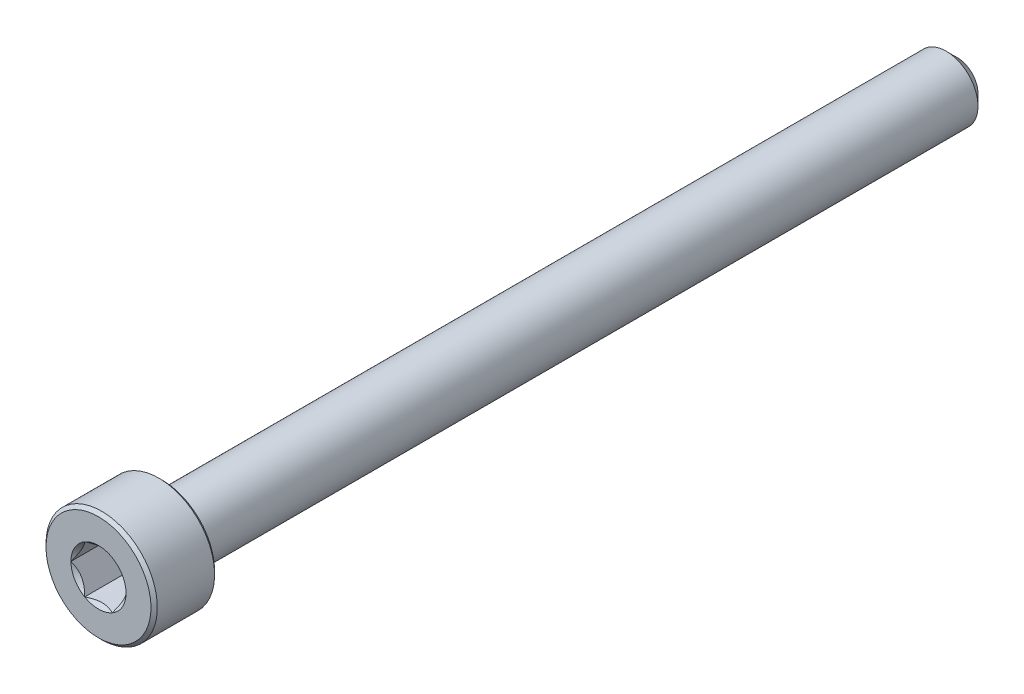
ISO-10303-21;
HEADER;
FILE_DESCRIPTION(('STEP AP214'),'2;1');
FILE_NAME('part.step','',(''),(''),'','','');
FILE_SCHEMA(('AUTOMOTIVE_DESIGN { 1 0 10303 214 1 1 1 1 }'));
ENDSEC;
DATA;
#1=APPLICATION_CONTEXT('core data for automotive mechanical design processes');
#2=APPLICATION_PROTOCOL_DEFINITION('international standard','automotive_design',2000,#1);
#3=PRODUCT_CONTEXT('',#1,'mechanical');
#4=PRODUCT('Part','Part','',(#3));
#5=PRODUCT_RELATED_PRODUCT_CATEGORY('part','',(#4));
#6=PRODUCT_DEFINITION_FORMATION('','',#4);
#7=PRODUCT_DEFINITION_CONTEXT('part definition',#1,'design');
#8=PRODUCT_DEFINITION('design','',#6,#7);
#9=PRODUCT_DEFINITION_SHAPE('','',#8);
#10=(LENGTH_UNIT() NAMED_UNIT(*) SI_UNIT(.MILLI.,.METRE.));
#11=(NAMED_UNIT(*) PLANE_ANGLE_UNIT() SI_UNIT($,.RADIAN.));
#12=(NAMED_UNIT(*) SI_UNIT($,.STERADIAN.) SOLID_ANGLE_UNIT());
#13=UNCERTAINTY_MEASURE_WITH_UNIT(LENGTH_MEASURE(1.E-05),#10,'distance_accuracy_value','');
#14=(GEOMETRIC_REPRESENTATION_CONTEXT(3) GLOBAL_UNCERTAINTY_ASSIGNED_CONTEXT((#13)) GLOBAL_UNIT_ASSIGNED_CONTEXT((#10,
#11,#12)) REPRESENTATION_CONTEXT('',''));
#15=CARTESIAN_POINT('',(0.,0.,0.));
#16=DIRECTION('',(0.,0.,1.));
#17=DIRECTION('',(1.,0.,0.));
#18=AXIS2_PLACEMENT_3D('',#15,#16,#17);
#19=CARTESIAN_POINT('',(0.,0.,27.));
#20=DIRECTION('',(0.,0.,1.));
#21=DIRECTION('',(1.,0.,0.));
#22=AXIS2_PLACEMENT_3D('',#19,#20,#21);
#23=PLANE('',#22);
#24=CARTESIAN_POINT('',(0.,0.,27.));
#25=DIRECTION('',(0.,0.,1.));
#26=DIRECTION('',(1.,0.,0.));
#27=AXIS2_PLACEMENT_3D('',#24,#25,#26);
#28=CIRCLE('',#27,1.73205080756888);
#29=CARTESIAN_POINT('',(1.73205080756888,0.,27.));
#30=VERTEX_POINT('',#29);
#31=CARTESIAN_POINT('',(0.866025403784439,1.5,27.));
#32=VERTEX_POINT('',#31);
#33=EDGE_CURVE('E105',#30,#32,#28,.T.);
#34=ORIENTED_EDGE('',*,*,#33,.F.);
#35=CARTESIAN_POINT('',(0.866025403784438,-1.5,27.));
#36=VERTEX_POINT('',#35);
#37=EDGE_CURVE('E95',#36,#30,#28,.T.);
#38=ORIENTED_EDGE('',*,*,#37,.F.);
#39=CARTESIAN_POINT('',(-0.866025403784438,-1.5,27.));
#40=VERTEX_POINT('',#39);
#41=EDGE_CURVE('E103',#40,#36,#28,.T.);
#42=ORIENTED_EDGE('',*,*,#41,.F.);
#43=CARTESIAN_POINT('',(-1.73205080756888,0.,27.));
#44=VERTEX_POINT('',#43);
#45=EDGE_CURVE('E267',#44,#40,#28,.T.);
#46=ORIENTED_EDGE('',*,*,#45,.F.);
#47=CARTESIAN_POINT('',(-0.866025403784438,1.5,27.));
#48=VERTEX_POINT('',#47);
#49=EDGE_CURVE('E127',#48,#44,#28,.T.);
#50=ORIENTED_EDGE('',*,*,#49,.F.);
#51=EDGE_CURVE('E126',#32,#48,#28,.T.);
#52=ORIENTED_EDGE('',*,*,#51,.F.);
#53=EDGE_LOOP('',(#34,#38,#42,#46,#50,#52));
#54=FACE_BOUND('',#53,.T.);
#55=CARTESIAN_POINT('',(0.,0.,27.));
#56=DIRECTION('',(0.,0.,-1.));
#57=DIRECTION('',(-1.,0.,0.));
#58=AXIS2_PLACEMENT_3D('',#55,#56,#57);
#59=CIRCLE('',#58,3.3);
#60=CARTESIAN_POINT('',(-3.3,0.,27.));
#61=VERTEX_POINT('',#60);
#62=EDGE_CURVE('E49',#61,#61,#59,.T.);
#63=ORIENTED_EDGE('',*,*,#62,.F.);
#64=EDGE_LOOP('',(#63));
#65=FACE_BOUND('',#64,.T.);
#66=ADVANCED_FACE('F36',(#54,#65),#23,.T.);
#67=CARTESIAN_POINT('',(0.,0.,26.8));
#68=DIRECTION('',(0.,0.,-1.));
#69=DIRECTION('',(-1.,0.,0.));
#70=AXIS2_PLACEMENT_3D('',#67,#68,#69);
#71=CONICAL_SURFACE('',#70,3.5,0.785398163397454);
#72=ORIENTED_EDGE('',*,*,#62,.T.);
#73=EDGE_LOOP('',(#72));
#74=FACE_BOUND('',#73,.T.);
#75=CARTESIAN_POINT('',(0.,0.,26.8));
#76=DIRECTION('',(0.,0.,-1.));
#77=DIRECTION('',(-1.,0.,0.));
#78=AXIS2_PLACEMENT_3D('',#75,#76,#77);
#79=CIRCLE('',#78,3.5);
#80=CARTESIAN_POINT('',(-3.5,0.,26.8));
#81=VERTEX_POINT('',#80);
#82=EDGE_CURVE('E221',#81,#81,#79,.T.);
#83=ORIENTED_EDGE('',*,*,#82,.F.);
#84=EDGE_LOOP('',(#83));
#85=FACE_BOUND('',#84,.T.);
#86=ADVANCED_FACE('F209',(#74,#85),#71,.T.);
#87=CARTESIAN_POINT('',(0.,0.,-27.));
#88=DIRECTION('',(0.,0.,-1.));
#89=DIRECTION('',(-1.,0.,0.));
#90=AXIS2_PLACEMENT_3D('',#87,#88,#89);
#91=CYLINDRICAL_SURFACE('',#90,3.5);
#92=ORIENTED_EDGE('',*,*,#82,.T.);
#93=EDGE_LOOP('',(#92));
#94=FACE_BOUND('',#93,.T.);
#95=CARTESIAN_POINT('',(0.,0.,23.2));
#96=DIRECTION('',(0.,0.,-1.));
#97=DIRECTION('',(-1.,0.,0.));
#98=AXIS2_PLACEMENT_3D('',#95,#96,#97);
#99=CIRCLE('',#98,3.5);
#100=CARTESIAN_POINT('',(-3.5,0.,23.2));
#101=VERTEX_POINT('',#100);
#102=EDGE_CURVE('E222',#101,#101,#99,.T.);
#103=ORIENTED_EDGE('',*,*,#102,.F.);
#104=EDGE_LOOP('',(#103));
#105=FACE_BOUND('',#104,.T.);
#106=ADVANCED_FACE('F206',(#94,#105),#91,.T.);
#107=CARTESIAN_POINT('',(0.,0.,23.));
#108=DIRECTION('',(0.,0.,1.));
#109=DIRECTION('',(1.,0.,0.));
#110=AXIS2_PLACEMENT_3D('',#107,#108,#109);
#111=CONICAL_SURFACE('',#110,3.3,0.785398163397454);
#112=ORIENTED_EDGE('',*,*,#102,.T.);
#113=EDGE_LOOP('',(#112));
#114=FACE_BOUND('',#113,.T.);
#115=CARTESIAN_POINT('',(0.,0.,23.));
#116=DIRECTION('',(0.,0.,-1.));
#117=DIRECTION('',(-1.,0.,0.));
#118=AXIS2_PLACEMENT_3D('',#115,#116,#117);
#119=CIRCLE('',#118,3.3);
#120=CARTESIAN_POINT('',(-3.3,0.,23.));
#121=VERTEX_POINT('',#120);
#122=EDGE_CURVE('E225',#121,#121,#119,.T.);
#123=ORIENTED_EDGE('',*,*,#122,.F.);
#124=EDGE_LOOP('',(#123));
#125=FACE_BOUND('',#124,.T.);
#126=ADVANCED_FACE('F202',(#114,#125),#111,.T.);
#127=CARTESIAN_POINT('',(0.,3.3,23.));
#128=DIRECTION('',(0.,0.,-1.));
#129=DIRECTION('',(-1.,0.,0.));
#130=AXIS2_PLACEMENT_3D('',#127,#128,#129);
#131=PLANE('',#130);
#132=ORIENTED_EDGE('',*,*,#122,.T.);
#133=EDGE_LOOP('',(#132));
#134=FACE_BOUND('',#133,.T.);
#135=CARTESIAN_POINT('',(0.,0.,23.));
#136=DIRECTION('',(0.,0.,-1.));
#137=DIRECTION('',(-1.,0.,0.));
#138=AXIS2_PLACEMENT_3D('',#135,#136,#137);
#139=CIRCLE('',#138,2.);
#140=CARTESIAN_POINT('',(-2.,0.,23.));
#141=VERTEX_POINT('',#140);
#142=EDGE_CURVE('E230',#141,#141,#139,.T.);
#143=ORIENTED_EDGE('',*,*,#142,.F.);
#144=EDGE_LOOP('',(#143));
#145=FACE_BOUND('',#144,.T.);
#146=ADVANCED_FACE('F198',(#134,#145),#131,.T.);
#147=CARTESIAN_POINT('',(0.,0.,-27.));
#148=DIRECTION('',(0.,0.,-1.));
#149=DIRECTION('',(-1.,0.,0.));
#150=AXIS2_PLACEMENT_3D('',#147,#148,#149);
#151=CYLINDRICAL_SURFACE('',#150,2.);
#152=ORIENTED_EDGE('',*,*,#142,.T.);
#153=EDGE_LOOP('',(#152));
#154=FACE_BOUND('',#153,.T.);
#155=CARTESIAN_POINT('',(0.,0.,-26.3));
#156=DIRECTION('',(0.,0.,-1.));
#157=DIRECTION('',(-1.,0.,0.));
#158=AXIS2_PLACEMENT_3D('',#155,#156,#157);
#159=CIRCLE('',#158,2.);
#160=CARTESIAN_POINT('',(-2.,0.,-26.3));
#161=VERTEX_POINT('',#160);
#162=EDGE_CURVE('E233',#161,#161,#159,.T.);
#163=ORIENTED_EDGE('',*,*,#162,.F.);
#164=EDGE_LOOP('',(#163));
#165=FACE_BOUND('',#164,.T.);
#166=ADVANCED_FACE('F194',(#154,#165),#151,.T.);
#167=CARTESIAN_POINT('',(0.,0.,-27.));
#168=DIRECTION('',(0.,0.,1.));
#169=DIRECTION('',(1.,0.,0.));
#170=AXIS2_PLACEMENT_3D('',#167,#168,#169);
#171=CONICAL_SURFACE('',#170,1.3,0.78539816339744);
#172=ORIENTED_EDGE('',*,*,#162,.T.);
#173=EDGE_LOOP('',(#172));
#174=FACE_BOUND('',#173,.T.);
#175=CARTESIAN_POINT('',(0.,0.,-27.));
#176=DIRECTION('',(0.,0.,-1.));
#177=DIRECTION('',(-1.,0.,0.));
#178=AXIS2_PLACEMENT_3D('',#175,#176,#177);
#179=CIRCLE('',#178,1.3);
#180=CARTESIAN_POINT('',(-1.3,0.,-27.));
#181=VERTEX_POINT('',#180);
#182=EDGE_CURVE('E236',#181,#181,#179,.T.);
#183=ORIENTED_EDGE('',*,*,#182,.F.);
#184=EDGE_LOOP('',(#183));
#185=FACE_BOUND('',#184,.T.);
#186=ADVANCED_FACE('F190',(#174,#185),#171,.T.);
#187=CARTESIAN_POINT('',(0.,1.3,-27.));
#188=DIRECTION('',(0.,0.,-1.));
#189=DIRECTION('',(-1.,0.,0.));
#190=AXIS2_PLACEMENT_3D('',#187,#188,#189);
#191=PLANE('',#190);
#192=ORIENTED_EDGE('',*,*,#182,.T.);
#193=EDGE_LOOP('',(#192));
#194=FACE_BOUND('',#193,.T.);
#195=ADVANCED_FACE('F187',(#194),#191,.T.);
#196=CARTESIAN_POINT('',(0.,0.,27.));
#197=DIRECTION('',(0.,0.,1.));
#198=DIRECTION('',(1.,0.,0.));
#199=AXIS2_PLACEMENT_3D('',#196,#197,#198);
#200=CONICAL_SURFACE('',#199,1.73205080756888,0.78539816339745);
#201=ORIENTED_EDGE('',*,*,#33,.T.);
#202=CARTESIAN_POINT('',(1.73216627762272,-0.000200000000000874,27.0001154816001));
#203=CARTESIAN_POINT('',(1.70239359975915,0.0513677907370746,26.9703654760673));
#204=CARTESIAN_POINT('',(1.67212305186355,0.1037979176652,26.9423624839103));
#205=CARTESIAN_POINT('',(1.61039789003619,0.210709034055596,26.8910892304401));
#206=CARTESIAN_POINT('',(1.57893740312614,0.265200195814661,26.8678475050444));
#207=CARTESIAN_POINT('',(1.51549879897987,0.375079081357249,26.8280337289922));
#208=CARTESIAN_POINT('',(1.4835368452681,0.4304388090952,26.8113615856709));
#209=CARTESIAN_POINT('',(1.41890915196211,0.542377257477152,26.7856744568181));
#210=CARTESIAN_POINT('',(1.38624538781118,0.59895255655301,26.7766402904789));
#211=CARTESIAN_POINT('',(1.32995210095299,0.696455389516443,26.7684890812268));
#212=CARTESIAN_POINT('',(1.30639533311124,0.737256908280468,26.7672822529892));
#213=CARTESIAN_POINT('',(1.25932335290193,0.81878796961586,26.7693140571623));
#214=CARTESIAN_POINT('',(1.23580815085313,0.859517494314632,26.7725536707483));
#215=CARTESIAN_POINT('',(1.18900414978426,0.940584402163418,26.783291985982));
#216=CARTESIAN_POINT('',(1.16571558211719,0.980921384598291,26.7907946530187));
#217=CARTESIAN_POINT('',(1.11952932016335,1.06091833691403,26.8096516119283));
#218=CARTESIAN_POINT('',(1.09663179808786,1.10057800851621,26.8210075570186));
#219=CARTESIAN_POINT('',(1.03798159809698,1.20216313477449,26.8547216475927));
#220=CARTESIAN_POINT('',(1.00259267147465,1.26345855370969,26.8796218490934));
#221=CARTESIAN_POINT('',(0.950557780604374,1.35358562846331,26.9216566532716));
#222=CARTESIAN_POINT('',(0.933410759677147,1.38328513990772,26.9364251535591));
#223=CARTESIAN_POINT('',(0.899432101996406,1.44213790138375,26.9673105659402));
#224=CARTESIAN_POINT('',(0.88260031928571,1.47129140422064,26.9834268341217));
#225=CARTESIAN_POINT('',(0.865909933730601,1.5002,27.0001154816001));
#226=B_SPLINE_CURVE_WITH_KNOTS('',3,(#202,#203,#204,#205,#206,#207,#208,#209,#210,#211,#212,
#213,#214,#215,#216,#217,#218,#219,#220,#221,#222,#223,#224,#225),.UNSPECIFIED.,.F.,.F.,(4,2,2,
2,2,2,2,2,2,2,2,4),(0.,0.199829143693305,0.40082298738239,0.598623720538184,0.795926240188893,
0.937113067959885,1.07833105577193,1.21968061668222,1.36109089931055,1.58570969637566,
1.69770705470964,1.80965120737194),.UNSPECIFIED.);
#227=EDGE_CURVE('E12',#30,#32,#226,.T.);
#228=ORIENTED_EDGE('',*,*,#227,.F.);
#229=EDGE_LOOP('',(#201,#228));
#230=FACE_BOUND('',#229,.T.);
#231=ADVANCED_FACE('F107',(#230),#200,.F.);
#232=ORIENTED_EDGE('',*,*,#37,.T.);
#233=CARTESIAN_POINT('',(0.8659099337306,-1.5002,27.0001154816001));
#234=CARTESIAN_POINT('',(0.895682611594165,-1.44863220926293,26.9703654760673));
#235=CARTESIAN_POINT('',(0.925953159489764,-1.3962020823348,26.9423624839103));
#236=CARTESIAN_POINT('',(0.987678321317123,-1.2892909659444,26.8910892304401));
#237=CARTESIAN_POINT('',(1.01913880822717,-1.23479980418534,26.8678475050444));
#238=CARTESIAN_POINT('',(1.08257741237344,-1.12492091864275,26.8280337289922));
#239=CARTESIAN_POINT('',(1.11453936608521,-1.0695611909048,26.8113615856709));
#240=CARTESIAN_POINT('',(1.1791670593912,-0.957622742522849,26.7856744568181));
#241=CARTESIAN_POINT('',(1.21183082354213,-0.901047443446991,26.7766402904789));
#242=CARTESIAN_POINT('',(1.26812411040032,-0.803544610483558,26.7684890812268));
#243=CARTESIAN_POINT('',(1.29168087824208,-0.762743091719533,26.7672822529892));
#244=CARTESIAN_POINT('',(1.33875285845138,-0.681212030384141,26.7693140571623));
#245=CARTESIAN_POINT('',(1.36226806050018,-0.64048250568537,26.7725536707483));
#246=CARTESIAN_POINT('',(1.40907206156905,-0.559415597836583,26.783291985982));
#247=CARTESIAN_POINT('',(1.43236062923612,-0.519078615401711,26.7907946530187));
#248=CARTESIAN_POINT('',(1.47854689118997,-0.439081663085968,26.8096516119283));
#249=CARTESIAN_POINT('',(1.50144441326545,-0.399421991483791,26.8210075570186));
#250=CARTESIAN_POINT('',(1.56009461325633,-0.297836865225514,26.8547216475927));
#251=CARTESIAN_POINT('',(1.59548353987866,-0.23654144629031,26.8796218490934));
#252=CARTESIAN_POINT('',(1.64751843074894,-0.146414371536685,26.9216566532716));
#253=CARTESIAN_POINT('',(1.66466545167617,-0.116714860092281,26.9364251535591));
#254=CARTESIAN_POINT('',(1.69864410935691,-0.0578620986162484,26.9673105659402));
#255=CARTESIAN_POINT('',(1.71547589206761,-0.0287085957793627,26.9834268341217));
#256=CARTESIAN_POINT('',(1.73216627762272,0.000199999999999534,27.0001154816001));
#257=B_SPLINE_CURVE_WITH_KNOTS('',3,(#233,#234,#235,#236,#237,#238,#239,#240,#241,#242,#243,
#244,#245,#246,#247,#248,#249,#250,#251,#252,#253,#254,#255,#256),.UNSPECIFIED.,.F.,.F.,(4,2,2,
2,2,2,2,2,2,2,2,4),(0.,0.199829143693305,0.40082298738239,0.598623720538183,0.795926240188891,
0.937113067959883,1.07833105577193,1.21968061668222,1.36109089931055,1.58570969637566,
1.69770705470964,1.80965120737194),.UNSPECIFIED.);
#258=EDGE_CURVE('E98',#36,#30,#257,.T.);
#259=ORIENTED_EDGE('',*,*,#258,.F.);
#260=EDGE_LOOP('',(#232,#259));
#261=FACE_BOUND('',#260,.T.);
#262=ADVANCED_FACE('F97',(#261),#200,.F.);
#263=ORIENTED_EDGE('',*,*,#41,.T.);
#264=CARTESIAN_POINT('',(-1.72720812969692,-1.5,27.5555785162708));
#265=CARTESIAN_POINT('',(-1.68515175699268,-1.5,27.5238299078574));
#266=CARTESIAN_POINT('',(-1.64286104748674,-1.5,27.4923925938074));
#267=CARTESIAN_POINT('',(-1.55771581035942,-1.5,27.4302690875564));
#268=CARTESIAN_POINT('',(-1.51486114386668,-1.5,27.3995830858922));
#269=CARTESIAN_POINT('',(-1.3846813415127,-1.5,27.3084071924272));
#270=CARTESIAN_POINT('',(-1.29637976071654,-1.5,27.2492883434268));
#271=CARTESIAN_POINT('',(-1.11121478730467,-1.5,27.1332309963165));
#272=CARTESIAN_POINT('',(-1.01415038238167,-1.5,27.076609558733));
#273=CARTESIAN_POINT('',(-0.815173408897603,-1.5,26.9730368812656));
#274=CARTESIAN_POINT('',(-0.713278669253283,-1.5,26.9260530415417));
#275=CARTESIAN_POINT('',(-0.56033377494311,-1.5,26.8685726684308));
#276=CARTESIAN_POINT('',(-0.511547982948041,-1.5,26.8520753877572));
#277=CARTESIAN_POINT('',(-0.412798620136866,-1.5,26.822997512927));
#278=CARTESIAN_POINT('',(-0.362834968437562,-1.5,26.810417188594));
#279=CARTESIAN_POINT('',(-0.262863235444983,-1.5,26.7900361941468));
#280=CARTESIAN_POINT('',(-0.212872113808024,-1.5,26.782153632746));
#281=CARTESIAN_POINT('',(-0.112355243569547,-1.5,26.771322063969));
#282=CARTESIAN_POINT('',(-0.0618295883726288,-1.5,26.7683722085243));
#283=CARTESIAN_POINT('',(0.0374291733323834,-1.5,26.7676248577248));
#284=CARTESIAN_POINT('',(0.0861609672002981,-1.5,26.7696447335581));
#285=CARTESIAN_POINT('',(0.183206937768826,-1.5,26.7783225528968));
#286=CARTESIAN_POINT('',(0.231521073438268,-1.5,26.7849809469685));
#287=CARTESIAN_POINT('',(0.328199853425434,-1.5,26.8026852441226));
#288=CARTESIAN_POINT('',(0.376550616310327,-1.5,26.813805811257));
#289=CARTESIAN_POINT('',(0.472195697125598,-1.5,26.8398434140487));
#290=CARTESIAN_POINT('',(0.51949010309274,-1.5,26.8547601320409));
#291=CARTESIAN_POINT('',(0.668391282696623,-1.5,26.9073352235961));
#292=CARTESIAN_POINT('',(0.767878709508551,-1.5,26.950981287472));
#293=CARTESIAN_POINT('',(0.962179866690722,-1.5,27.0480229945931));
#294=CARTESIAN_POINT('',(1.05697519961444,-1.5,27.1014536650895));
#295=CARTESIAN_POINT('',(1.23814273533383,-1.5,27.2116858520046));
#296=CARTESIAN_POINT('',(1.32469942181289,-1.5,27.2681879206986));
#297=CARTESIAN_POINT('',(1.45222331290673,-1.5,27.3555343015787));
#298=CARTESIAN_POINT('',(1.49418091978756,-1.5,27.38495775868));
#299=CARTESIAN_POINT('',(1.57752272931476,-1.5,27.4445828218305));
#300=CARTESIAN_POINT('',(1.61890708647354,-1.5,27.4747842116644));
#301=CARTESIAN_POINT('',(1.66005278019494,-1.5,27.5053081786095));
#302=B_SPLINE_CURVE_WITH_KNOTS('',3,(#264,#265,#266,#267,#268,#269,#270,#271,#272,#273,#274,
#275,#276,#277,#278,#279,#280,#281,#282,#283,#284,#285,#286,#287,#288,#289,#290,#291,#292,#293,
#294,#295,#296,#297,#298,#299,#300,#301),.UNSPECIFIED.,.F.,.F.,(4,2,2,2,2,2,2,2,2,2,2,2,2,2,2,2,
2,2,4),(0.,0.158079548982667,0.31619878099394,0.634850417346958,0.97169031136151,
1.30737131660667,1.46173961127089,1.61611853740677,1.76772101421409,1.91929742368538,
2.065387412096,2.21149159305544,2.36014984633872,2.50879566386709,2.83376031422673,
3.15991186985651,3.46985601802197,3.62358896039973,3.7772796264207),.UNSPECIFIED.);
#303=EDGE_CURVE('E116',#40,#36,#302,.T.);
#304=ORIENTED_EDGE('',*,*,#303,.F.);
#305=EDGE_LOOP('',(#263,#304));
#306=FACE_BOUND('',#305,.T.);
#307=ADVANCED_FACE('F273',(#306),#200,.F.);
#308=ORIENTED_EDGE('',*,*,#45,.T.);
#309=CARTESIAN_POINT('',(-1.73216627762272,0.000200000000000134,27.0001154816001));
#310=CARTESIAN_POINT('',(-1.70239359975915,-0.0513677907370754,26.9703654760673));
#311=CARTESIAN_POINT('',(-1.67212305186355,-0.103797917665201,26.9423624839103));
#312=CARTESIAN_POINT('',(-1.61039789003619,-0.210709034055597,26.8910892304401));
#313=CARTESIAN_POINT('',(-1.57893740312614,-0.265200195814662,26.8678475050444));
#314=CARTESIAN_POINT('',(-1.51549879897987,-0.37507908135725,26.8280337289922));
#315=CARTESIAN_POINT('',(-1.4835368452681,-0.430438809095201,26.8113615856709));
#316=CARTESIAN_POINT('',(-1.41890915196211,-0.542377257477152,26.7856744568181));
#317=CARTESIAN_POINT('',(-1.38624538781118,-0.59895255655301,26.7766402904789));
#318=CARTESIAN_POINT('',(-1.32995210095299,-0.696455389516442,26.7684890812268));
#319=CARTESIAN_POINT('',(-1.30639533311124,-0.737256908280468,26.7672822529892));
#320=CARTESIAN_POINT('',(-1.25932335290193,-0.818787969615859,26.7693140571623));
#321=CARTESIAN_POINT('',(-1.23580815085313,-0.859517494314631,26.7725536707483));
#322=CARTESIAN_POINT('',(-1.18900414978427,-0.940584402163417,26.783291985982));
#323=CARTESIAN_POINT('',(-1.16571558211719,-0.98092138459829,26.7907946530187));
#324=CARTESIAN_POINT('',(-1.11952932016335,-1.06091833691403,26.8096516119283));
#325=CARTESIAN_POINT('',(-1.09663179808786,-1.10057800851621,26.8210075570186));
#326=CARTESIAN_POINT('',(-1.03798159809698,-1.20216313477449,26.8547216475927));
#327=CARTESIAN_POINT('',(-1.00259267147465,-1.26345855370969,26.8796218490934));
#328=CARTESIAN_POINT('',(-0.950557780604374,-1.35358562846332,26.9216566532716));
#329=CARTESIAN_POINT('',(-0.933410759677147,-1.38328513990772,26.9364251535591));
#330=CARTESIAN_POINT('',(-0.899432101996406,-1.44213790138375,26.9673105659402));
#331=CARTESIAN_POINT('',(-0.88260031928571,-1.47129140422064,26.9834268341217));
#332=CARTESIAN_POINT('',(-0.865909933730601,-1.5002,27.0001154816001));
#333=B_SPLINE_CURVE_WITH_KNOTS('',3,(#309,#310,#311,#312,#313,#314,#315,#316,#317,#318,#319,
#320,#321,#322,#323,#324,#325,#326,#327,#328,#329,#330,#331,#332),.UNSPECIFIED.,.F.,.F.,(4,2,2,
2,2,2,2,2,2,2,2,4),(0.,0.199829143693306,0.40082298738239,0.598623720538183,0.795926240188891,
0.937113067959883,1.07833105577193,1.21968061668222,1.36109089931055,1.58570969637566,
1.69770705470964,1.80965120737194),.UNSPECIFIED.);
#334=EDGE_CURVE('E153',#44,#40,#333,.T.);
#335=ORIENTED_EDGE('',*,*,#334,.F.);
#336=EDGE_LOOP('',(#308,#335));
#337=FACE_BOUND('',#336,.T.);
#338=ADVANCED_FACE('F306',(#337),#200,.F.);
#339=ORIENTED_EDGE('',*,*,#49,.T.);
#340=CARTESIAN_POINT('',(-0.865909933730601,1.5002,27.0001154816001));
#341=CARTESIAN_POINT('',(-0.895682611594165,1.44863220926292,26.9703654760673));
#342=CARTESIAN_POINT('',(-0.925953159489764,1.3962020823348,26.9423624839103));
#343=CARTESIAN_POINT('',(-0.987678321317123,1.2892909659444,26.8910892304401));
#344=CARTESIAN_POINT('',(-1.01913880822717,1.23479980418534,26.8678475050444));
#345=CARTESIAN_POINT('',(-1.08257741237344,1.12492091864275,26.8280337289922));
#346=CARTESIAN_POINT('',(-1.11453936608521,1.0695611909048,26.8113615856709));
#347=CARTESIAN_POINT('',(-1.1791670593912,0.957622742522849,26.7856744568181));
#348=CARTESIAN_POINT('',(-1.21183082354213,0.901047443446991,26.7766402904789));
#349=CARTESIAN_POINT('',(-1.26812411040032,0.803544610483558,26.7684890812268));
#350=CARTESIAN_POINT('',(-1.29168087824208,0.762743091719533,26.7672822529892));
#351=CARTESIAN_POINT('',(-1.33875285845138,0.68121203038414,26.7693140571623));
#352=CARTESIAN_POINT('',(-1.36226806050018,0.640482505685369,26.7725536707483));
#353=CARTESIAN_POINT('',(-1.40907206156905,0.559415597836583,26.783291985982));
#354=CARTESIAN_POINT('',(-1.43236062923612,0.51907861540171,26.7907946530187));
#355=CARTESIAN_POINT('',(-1.47854689118997,0.439081663085968,26.8096516119283));
#356=CARTESIAN_POINT('',(-1.50144441326545,0.399421991483791,26.8210075570186));
#357=CARTESIAN_POINT('',(-1.56009461325633,0.297836865225514,26.8547216475927));
#358=CARTESIAN_POINT('',(-1.59548353987866,0.236541446290309,26.8796218490934));
#359=CARTESIAN_POINT('',(-1.64751843074894,0.146414371536686,26.9216566532716));
#360=CARTESIAN_POINT('',(-1.66466545167617,0.116714860092283,26.9364251535591));
#361=CARTESIAN_POINT('',(-1.69864410935691,0.0578620986162502,26.9673105659402));
#362=CARTESIAN_POINT('',(-1.71547589206761,0.0287085957793638,26.9834268341217));
#363=CARTESIAN_POINT('',(-1.73216627762272,-0.000199999999999435,27.0001154816001));
#364=B_SPLINE_CURVE_WITH_KNOTS('',3,(#340,#341,#342,#343,#344,#345,#346,#347,#348,#349,#350,
#351,#352,#353,#354,#355,#356,#357,#358,#359,#360,#361,#362,#363),.UNSPECIFIED.,.F.,.F.,(4,2,2,
2,2,2,2,2,2,2,2,4),(0.,0.199829143693305,0.40082298738239,0.598623720538182,0.795926240188891,
0.937113067959884,1.07833105577193,1.21968061668222,1.36109089931055,1.58570969637566,
1.69770705470964,1.80965120737194),.UNSPECIFIED.);
#365=EDGE_CURVE('E160',#48,#44,#364,.T.);
#366=ORIENTED_EDGE('',*,*,#365,.F.);
#367=EDGE_LOOP('',(#339,#366));
#368=FACE_BOUND('',#367,.T.);
#369=ADVANCED_FACE('F145',(#368),#200,.F.);
#370=ORIENTED_EDGE('',*,*,#51,.T.);
#371=CARTESIAN_POINT('',(-1.72720812969692,1.5,27.5555785162708));
#372=CARTESIAN_POINT('',(-1.68515175699267,1.5,27.5238299078574));
#373=CARTESIAN_POINT('',(-1.64286104748673,1.5,27.4923925938074));
#374=CARTESIAN_POINT('',(-1.55771581035942,1.5,27.4302690875564));
#375=CARTESIAN_POINT('',(-1.51486114386668,1.5,27.3995830858922));
#376=CARTESIAN_POINT('',(-1.3846813415127,1.5,27.3084071924272));
#377=CARTESIAN_POINT('',(-1.29637976071653,1.5,27.2492883434268));
#378=CARTESIAN_POINT('',(-1.11121478730467,1.5,27.1332309963165));
#379=CARTESIAN_POINT('',(-1.01415038238167,1.5,27.076609558733));
#380=CARTESIAN_POINT('',(-0.815173408897604,1.5,26.9730368812656));
#381=CARTESIAN_POINT('',(-0.713278669253283,1.5,26.9260530415417));
#382=CARTESIAN_POINT('',(-0.560333774943111,1.5,26.8685726684308));
#383=CARTESIAN_POINT('',(-0.511547982948041,1.5,26.8520753877572));
#384=CARTESIAN_POINT('',(-0.412798620136866,1.5,26.822997512927));
#385=CARTESIAN_POINT('',(-0.362834968437562,1.5,26.810417188594));
#386=CARTESIAN_POINT('',(-0.262863235444981,1.5,26.7900361941468));
#387=CARTESIAN_POINT('',(-0.212872113808021,1.5,26.782153632746));
#388=CARTESIAN_POINT('',(-0.112355243569544,1.5,26.771322063969));
#389=CARTESIAN_POINT('',(-0.061829588372626,1.5,26.7683722085243));
#390=CARTESIAN_POINT('',(0.0374291733323862,1.5,26.7676248577248));
#391=CARTESIAN_POINT('',(0.086160967200301,1.5,26.7696447335581));
#392=CARTESIAN_POINT('',(0.183206937768829,1.5,26.7783225528968));
#393=CARTESIAN_POINT('',(0.231521073438271,1.5,26.7849809469685));
#394=CARTESIAN_POINT('',(0.328199853425438,1.5,26.8026852441226));
#395=CARTESIAN_POINT('',(0.37655061631033,1.5,26.813805811257));
#396=CARTESIAN_POINT('',(0.4721956971256,1.5,26.8398434140487));
#397=CARTESIAN_POINT('',(0.519490103092741,1.5,26.8547601320409));
#398=CARTESIAN_POINT('',(0.668391282696625,1.5,26.9073352235961));
#399=CARTESIAN_POINT('',(0.767878709508554,1.5,26.950981287472));
#400=CARTESIAN_POINT('',(0.962179866690725,1.5,27.0480229945931));
#401=CARTESIAN_POINT('',(1.05697519961444,1.5,27.1014536650895));
#402=CARTESIAN_POINT('',(1.23814273533383,1.5,27.2116858520046));
#403=CARTESIAN_POINT('',(1.3246994218129,1.5,27.2681879206986));
#404=CARTESIAN_POINT('',(1.45222331290674,1.5,27.3555343015787));
#405=CARTESIAN_POINT('',(1.49418091978756,1.5,27.38495775868));
#406=CARTESIAN_POINT('',(1.57752272931476,1.5,27.4445828218305));
#407=CARTESIAN_POINT('',(1.61890708647354,1.5,27.4747842116644));
#408=CARTESIAN_POINT('',(1.66005278019494,1.5,27.5053081786095));
#409=B_SPLINE_CURVE_WITH_KNOTS('',3,(#371,#372,#373,#374,#375,#376,#377,#378,#379,#380,#381,
#382,#383,#384,#385,#386,#387,#388,#389,#390,#391,#392,#393,#394,#395,#396,#397,#398,#399,#400,
#401,#402,#403,#404,#405,#406,#407,#408),.UNSPECIFIED.,.F.,.F.,(4,2,2,2,2,2,2,2,2,2,2,2,2,2,2,2,
2,2,4),(0.,0.158079548982669,0.31619878099394,0.634850417346955,0.971690311361509,
1.30737131660667,1.46173961127088,1.61611853740677,1.76772101421409,1.91929742368538,
2.065387412096,2.21149159305544,2.36014984633872,2.50879566386709,2.83376031422673,
3.15991186985651,3.46985601802197,3.62358896039973,3.7772796264207),.UNSPECIFIED.);
#410=EDGE_CURVE('E55',#32,#48,#409,.F.);
#411=ORIENTED_EDGE('',*,*,#410,.F.);
#412=EDGE_LOOP('',(#370,#411));
#413=FACE_BOUND('',#412,.T.);
#414=ADVANCED_FACE('F141',(#413),#200,.F.);
#415=CARTESIAN_POINT('',(0.,3.3,24.));
#416=DIRECTION('',(0.,0.,-1.));
#417=DIRECTION('',(-1.,0.,0.));
#418=AXIS2_PLACEMENT_3D('',#415,#416,#417);
#419=PLANE('',#418);
#420=DIRECTION('',(-0.5,0.866025403784439,0.));
#421=VECTOR('',#420,1.);
#422=CARTESIAN_POINT('',(1.73205080756888,0.,24.));
#423=LINE('',#422,#421);
#424=CARTESIAN_POINT('',(1.73205080756888,0.,24.));
#425=VERTEX_POINT('',#424);
#426=CARTESIAN_POINT('',(0.866025403784438,1.5,24.));
#427=VERTEX_POINT('',#426);
#428=EDGE_CURVE('E120',#425,#427,#423,.T.);
#429=ORIENTED_EDGE('',*,*,#428,.T.);
#430=DIRECTION('',(-1.,0.,0.));
#431=VECTOR('',#430,1.);
#432=CARTESIAN_POINT('',(0.866025403784438,1.5,24.));
#433=LINE('',#432,#431);
#434=CARTESIAN_POINT('',(-0.866025403784439,1.5,24.));
#435=VERTEX_POINT('',#434);
#436=EDGE_CURVE('E245',#427,#435,#433,.T.);
#437=ORIENTED_EDGE('',*,*,#436,.T.);
#438=DIRECTION('',(-0.5,-0.866025403784438,0.));
#439=VECTOR('',#438,1.);
#440=CARTESIAN_POINT('',(-0.866025403784439,1.5,24.));
#441=LINE('',#440,#439);
#442=CARTESIAN_POINT('',(-1.73205080756888,0.,24.));
#443=VERTEX_POINT('',#442);
#444=EDGE_CURVE('E244',#435,#443,#441,.T.);
#445=ORIENTED_EDGE('',*,*,#444,.T.);
#446=DIRECTION('',(0.5,-0.866025403784439,0.));
#447=VECTOR('',#446,1.);
#448=CARTESIAN_POINT('',(-1.73205080756888,0.,24.));
#449=LINE('',#448,#447);
#450=CARTESIAN_POINT('',(-0.866025403784439,-1.5,24.));
#451=VERTEX_POINT('',#450);
#452=EDGE_CURVE('E249',#443,#451,#449,.T.);
#453=ORIENTED_EDGE('',*,*,#452,.T.);
#454=DIRECTION('',(1.,0.,0.));
#455=VECTOR('',#454,1.);
#456=CARTESIAN_POINT('',(-0.866025403784439,-1.5,24.));
#457=LINE('',#456,#455);
#458=CARTESIAN_POINT('',(0.866025403784438,-1.5,24.));
#459=VERTEX_POINT('',#458);
#460=EDGE_CURVE('E253',#451,#459,#457,.T.);
#461=ORIENTED_EDGE('',*,*,#460,.T.);
#462=DIRECTION('',(0.5,0.866025403784439,0.));
#463=VECTOR('',#462,1.);
#464=CARTESIAN_POINT('',(0.866025403784438,-1.5,24.));
#465=LINE('',#464,#463);
#466=EDGE_CURVE('E121',#459,#425,#465,.T.);
#467=ORIENTED_EDGE('',*,*,#466,.T.);
#468=EDGE_LOOP('',(#429,#437,#445,#453,#461,#467));
#469=FACE_BOUND('',#468,.T.);
#470=ADVANCED_FACE('F144',(#469),#419,.F.);
#471=CARTESIAN_POINT('',(1.73205080756888,0.,18.4174243050442));
#472=DIRECTION('',(0.866025403784439,0.5,0.));
#473=DIRECTION('',(-0.5,0.866025403784439,0.));
#474=AXIS2_PLACEMENT_3D('',#471,#472,#473);
#475=PLANE('',#474);
#476=DIRECTION('',(0.,0.,1.));
#477=VECTOR('',#476,1.);
#478=CARTESIAN_POINT('',(1.73205080756888,0.,18.4174243050442));
#479=LINE('',#478,#477);
#480=EDGE_CURVE('E114',#425,#30,#479,.T.);
#481=ORIENTED_EDGE('',*,*,#480,.T.);
#482=ORIENTED_EDGE('',*,*,#227,.T.);
#483=DIRECTION('',(0.,0.,1.));
#484=VECTOR('',#483,1.);
#485=CARTESIAN_POINT('',(0.866025403784438,1.5,18.4174243050442));
#486=LINE('',#485,#484);
#487=EDGE_CURVE('E239',#427,#32,#486,.T.);
#488=ORIENTED_EDGE('',*,*,#487,.F.);
#489=ORIENTED_EDGE('',*,*,#428,.F.);
#490=EDGE_LOOP('',(#481,#482,#488,#489));
#491=FACE_BOUND('',#490,.T.);
#492=ADVANCED_FACE('F118',(#491),#475,.F.);
#493=CARTESIAN_POINT('',(0.866025403784438,-1.5,18.4174243050442));
#494=DIRECTION('',(0.866025403784438,-0.5,0.));
#495=DIRECTION('',(0.5,0.866025403784439,0.));
#496=AXIS2_PLACEMENT_3D('',#493,#494,#495);
#497=PLANE('',#496);
#498=DIRECTION('',(0.,0.,1.));
#499=VECTOR('',#498,1.);
#500=CARTESIAN_POINT('',(0.866025403784438,-1.5,18.4174243050442));
#501=LINE('',#500,#499);
#502=EDGE_CURVE('E63',#459,#36,#501,.T.);
#503=ORIENTED_EDGE('',*,*,#502,.T.);
#504=ORIENTED_EDGE('',*,*,#258,.T.);
#505=ORIENTED_EDGE('',*,*,#480,.F.);
#506=ORIENTED_EDGE('',*,*,#466,.F.);
#507=EDGE_LOOP('',(#503,#504,#505,#506));
#508=FACE_BOUND('',#507,.T.);
#509=ADVANCED_FACE('F113',(#508),#497,.F.);
#510=CARTESIAN_POINT('',(-0.866025403784439,-1.5,18.4174243050442));
#511=DIRECTION('',(0.,-1.,0.));
#512=DIRECTION('',(1.,0.,0.));
#513=AXIS2_PLACEMENT_3D('',#510,#511,#512);
#514=PLANE('',#513);
#515=DIRECTION('',(0.,0.,1.));
#516=VECTOR('',#515,1.);
#517=CARTESIAN_POINT('',(-0.866025403784439,-1.5,18.4174243050442));
#518=LINE('',#517,#516);
#519=EDGE_CURVE('E250',#451,#40,#518,.T.);
#520=ORIENTED_EDGE('',*,*,#519,.T.);
#521=ORIENTED_EDGE('',*,*,#303,.T.);
#522=ORIENTED_EDGE('',*,*,#502,.F.);
#523=ORIENTED_EDGE('',*,*,#460,.F.);
#524=EDGE_LOOP('',(#520,#521,#522,#523));
#525=FACE_BOUND('',#524,.T.);
#526=ADVANCED_FACE('F278',(#525),#514,.F.);
#527=CARTESIAN_POINT('',(-1.73205080756888,0.,18.4174243050442));
#528=DIRECTION('',(-0.866025403784439,-0.5,0.));
#529=DIRECTION('',(0.5,-0.866025403784439,0.));
#530=AXIS2_PLACEMENT_3D('',#527,#528,#529);
#531=PLANE('',#530);
#532=DIRECTION('',(0.,0.,1.));
#533=VECTOR('',#532,1.);
#534=CARTESIAN_POINT('',(-1.73205080756888,0.,18.4174243050442));
#535=LINE('',#534,#533);
#536=EDGE_CURVE('E246',#443,#44,#535,.T.);
#537=ORIENTED_EDGE('',*,*,#536,.T.);
#538=ORIENTED_EDGE('',*,*,#334,.T.);
#539=ORIENTED_EDGE('',*,*,#519,.F.);
#540=ORIENTED_EDGE('',*,*,#452,.F.);
#541=EDGE_LOOP('',(#537,#538,#539,#540));
#542=FACE_BOUND('',#541,.T.);
#543=ADVANCED_FACE('F177',(#542),#531,.F.);
#544=CARTESIAN_POINT('',(-0.866025403784439,1.5,18.4174243050442));
#545=DIRECTION('',(-0.866025403784438,0.5,0.));
#546=DIRECTION('',(-0.5,-0.866025403784438,0.));
#547=AXIS2_PLACEMENT_3D('',#544,#545,#546);
#548=PLANE('',#547);
#549=DIRECTION('',(0.,0.,1.));
#550=VECTOR('',#549,1.);
#551=CARTESIAN_POINT('',(-0.866025403784439,1.5,18.4174243050442));
#552=LINE('',#551,#550);
#553=EDGE_CURVE('E241',#435,#48,#552,.T.);
#554=ORIENTED_EDGE('',*,*,#553,.T.);
#555=ORIENTED_EDGE('',*,*,#365,.T.);
#556=ORIENTED_EDGE('',*,*,#536,.F.);
#557=ORIENTED_EDGE('',*,*,#444,.F.);
#558=EDGE_LOOP('',(#554,#555,#556,#557));
#559=FACE_BOUND('',#558,.T.);
#560=ADVANCED_FACE('F173',(#559),#548,.F.);
#561=CARTESIAN_POINT('',(0.866025403784438,1.5,18.4174243050442));
#562=DIRECTION('',(0.,1.,0.));
#563=DIRECTION('',(0.,0.,1.));
#564=AXIS2_PLACEMENT_3D('',#561,#562,#563);
#565=PLANE('',#564);
#566=ORIENTED_EDGE('',*,*,#487,.T.);
#567=ORIENTED_EDGE('',*,*,#410,.T.);
#568=ORIENTED_EDGE('',*,*,#553,.F.);
#569=ORIENTED_EDGE('',*,*,#436,.F.);
#570=EDGE_LOOP('',(#566,#567,#568,#569));
#571=FACE_BOUND('',#570,.T.);
#572=ADVANCED_FACE('F176',(#571),#565,.F.);
#573=CLOSED_SHELL('',(#66,#86,#106,#126,#146,#166,#186,#195,#231,#262,#307,#338,#369,#414,#470,
#492,#509,#526,#543,#560,#572));
#574=MANIFOLD_SOLID_BREP('B2',#573);
#575=ADVANCED_BREP_SHAPE_REPRESENTATION('',(#18,#574),#14);
#576=SHAPE_DEFINITION_REPRESENTATION(#9,#575);
ENDSEC;
END-ISO-10303-21;
